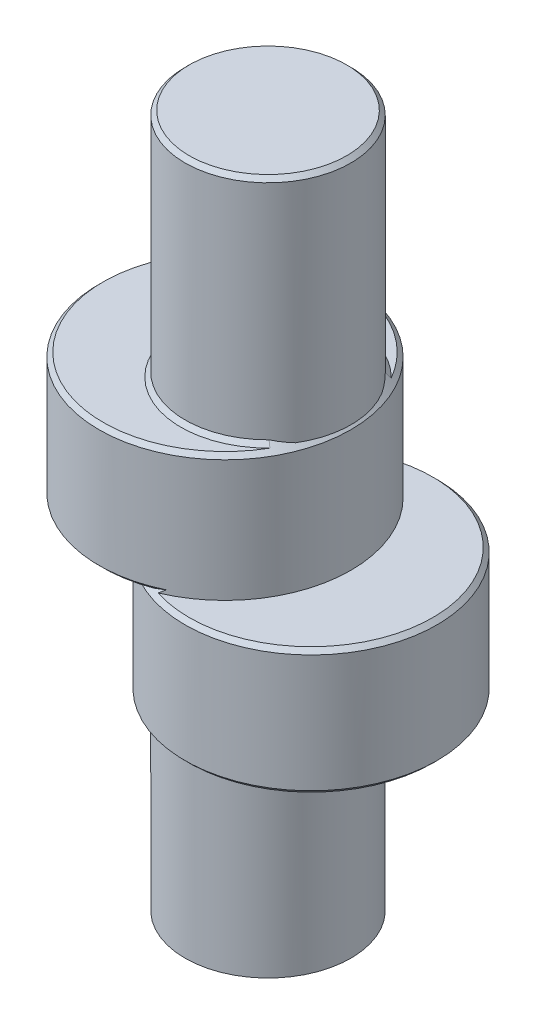
ISO-10303-21;
HEADER;
FILE_DESCRIPTION(('STEP AP214'),'2;1');
FILE_NAME('part.step','',(''),(''),'','','');
FILE_SCHEMA(('AUTOMOTIVE_DESIGN { 1 0 10303 214 1 1 1 1 }'));
ENDSEC;
DATA;
#1=APPLICATION_CONTEXT('core data for automotive mechanical design processes');
#2=APPLICATION_PROTOCOL_DEFINITION('international standard','automotive_design',2000,#1);
#3=PRODUCT_CONTEXT('',#1,'mechanical');
#4=PRODUCT('Part','Part','',(#3));
#5=PRODUCT_RELATED_PRODUCT_CATEGORY('part','',(#4));
#6=PRODUCT_DEFINITION_FORMATION('','',#4);
#7=PRODUCT_DEFINITION_CONTEXT('part definition',#1,'design');
#8=PRODUCT_DEFINITION('design','',#6,#7);
#9=PRODUCT_DEFINITION_SHAPE('','',#8);
#10=(LENGTH_UNIT() NAMED_UNIT(*) SI_UNIT(.MILLI.,.METRE.));
#11=(NAMED_UNIT(*) PLANE_ANGLE_UNIT() SI_UNIT($,.RADIAN.));
#12=(NAMED_UNIT(*) SI_UNIT($,.STERADIAN.) SOLID_ANGLE_UNIT());
#13=UNCERTAINTY_MEASURE_WITH_UNIT(LENGTH_MEASURE(1.E-05),#10,'distance_accuracy_value','');
#14=(GEOMETRIC_REPRESENTATION_CONTEXT(3) GLOBAL_UNCERTAINTY_ASSIGNED_CONTEXT((#13)) GLOBAL_UNIT_ASSIGNED_CONTEXT((#10,
#11,#12)) REPRESENTATION_CONTEXT('',''));
#15=CARTESIAN_POINT('',(0.,0.,0.));
#16=DIRECTION('',(0.,0.,1.));
#17=DIRECTION('',(1.,0.,0.));
#18=AXIS2_PLACEMENT_3D('',#15,#16,#17);
#19=CARTESIAN_POINT('',(0.,10.,0.));
#20=DIRECTION('',(0.,-1.,0.));
#21=DIRECTION('',(0.,0.,-1.));
#22=AXIS2_PLACEMENT_3D('',#19,#20,#21);
#23=CYLINDRICAL_SURFACE('',#22,3.95);
#24=CARTESIAN_POINT('',(0.,10.,0.));
#25=DIRECTION('',(0.,1.,0.));
#26=DIRECTION('',(0.,0.,1.));
#27=AXIS2_PLACEMENT_3D('',#24,#25,#26);
#28=CIRCLE('',#27,3.95);
#29=CARTESIAN_POINT('',(-3.37439024390243,10.,2.05328772505368));
#30=VERTEX_POINT('',#29);
#31=CARTESIAN_POINT('',(-3.37439024390243,10.,-2.05328772505368));
#32=VERTEX_POINT('',#31);
#33=EDGE_CURVE('E157',#30,#32,#28,.T.);
#34=ORIENTED_EDGE('',*,*,#33,.F.);
#35=CARTESIAN_POINT('',(-3.37439024390243,10.,2.05328772505369));
#36=CARTESIAN_POINT('',(-3.42967364303386,10.0195381703899,1.96246057851847));
#37=CARTESIAN_POINT('',(-3.48139858508568,10.0377231002952,1.86917038134896));
#38=CARTESIAN_POINT('',(-3.57732520450853,10.0713133705831,1.67828200673555));
#39=CARTESIAN_POINT('',(-3.62152446386587,10.0867178176873,1.58068245732677));
#40=CARTESIAN_POINT('',(-3.70100269343805,10.1143297136207,1.38421253707191));
#41=CARTESIAN_POINT('',(-3.73646851013048,10.1266043734462,1.28542733187354));
#42=CARTESIAN_POINT('',(-3.79948032301669,10.1483600657345,1.08511589292342));
#43=CARTESIAN_POINT('',(-3.82702897939272,10.1578420365733,0.983590592421377));
#44=CARTESIAN_POINT('',(-3.88317962393429,10.1771369006507,0.738143815824763));
#45=CARTESIAN_POINT('',(-3.90795747359519,10.1856211614256,0.593210719135296));
#46=CARTESIAN_POINT('',(-3.93305010961774,10.1942065758194,0.373109785587389));
#47=CARTESIAN_POINT('',(-3.93940282862085,10.1963784557658,0.298649728434228));
#48=CARTESIAN_POINT('',(-3.94787753357165,10.1992748807604,0.14946687337808));
#49=CARTESIAN_POINT('',(-3.94999984103968,10.1999995358009,0.0747440958748538));
#50=CARTESIAN_POINT('',(-3.95,10.2,9.71357262047595E-12));
#51=B_SPLINE_CURVE_WITH_KNOTS('',3,(#35,#36,#37,#38,#39,#40,#41,#42,#43,#44,#45,#46,#47,#48,#49,
#50),.UNSPECIFIED.,.F.,.F.,(4,2,2,2,2,2,2,4),(0.,0.324240447661163,0.648584878499235,
0.965229897077277,1.28176839754942,1.72244864375406,1.94662192283391,2.17077816361467),.UNSPECIFIED.);
#52=CARTESIAN_POINT('',(-3.95,10.2,9.71379337256074E-12));
#53=VERTEX_POINT('',#52);
#54=EDGE_CURVE('E12',#30,#53,#51,.T.);
#55=ORIENTED_EDGE('',*,*,#54,.T.);
#56=CARTESIAN_POINT('',(-3.95,10.2,9.71379337256074E-12));
#57=CARTESIAN_POINT('',(-3.95001468505227,10.200002642253,-0.107369212286794));
#58=CARTESIAN_POINT('',(-3.9456226945118,10.198504344766,-0.214733994457491));
#59=CARTESIAN_POINT('',(-3.92813265017341,10.1925253786307,-0.428676269684234));
#60=CARTESIAN_POINT('',(-3.91503401450889,10.1880445106568,-0.535253709640706));
#61=CARTESIAN_POINT('',(-3.88064553944285,10.176259582332,-0.744350263658397));
#62=CARTESIAN_POINT('',(-3.859554764775,10.1690241134194,-0.846905961893443));
#63=CARTESIAN_POINT('',(-3.80938651502774,10.1517694211677,-1.04975943933612));
#64=CARTESIAN_POINT('',(-3.78031108769569,10.1417509115608,-1.15005779033799));
#65=CARTESIAN_POINT('',(-3.70069847976816,10.1142307854436,-1.38890936473224));
#66=CARTESIAN_POINT('',(-3.64626379002597,10.0953496172278,-1.52603761151626));
#67=CARTESIAN_POINT('',(-3.55320729017361,10.0628720527805,-1.72708239966373));
#68=CARTESIAN_POINT('',(-3.51995374926938,10.0512359727395,-1.79387181355818));
#69=CARTESIAN_POINT('',(-3.44984165088276,10.0266200925371,-1.92526142978619));
#70=CARTESIAN_POINT('',(-3.41298368278576,10.0136405120408,-1.98986198771668));
#71=CARTESIAN_POINT('',(-3.37439024391223,10.0000000000035,-2.05328772503757));
#72=B_SPLINE_CURVE_WITH_KNOTS('',3,(#56,#57,#58,#59,#60,#61,#62,#63,#64,#65,#66,#67,#68,#69,#70,
#71),.UNSPECIFIED.,.F.,.F.,(4,2,2,2,2,2,2,4),(0.,0.322000303432794,0.64402212836478,
0.958500659210683,1.27289861395836,1.71795919754196,1.94438601703123,2.17077587358222),.UNSPECIFIED.);
#73=EDGE_CURVE('E63',#53,#32,#72,.T.);
#74=ORIENTED_EDGE('',*,*,#73,.T.);
#75=EDGE_LOOP('',(#34,#55,#74));
#76=FACE_BOUND('',#75,.T.);
#77=CARTESIAN_POINT('',(0.,0.,0.));
#78=DIRECTION('',(0.,1.,0.));
#79=DIRECTION('',(0.,0.,1.));
#80=AXIS2_PLACEMENT_3D('',#77,#78,#79);
#81=CIRCLE('',#80,3.95);
#82=CARTESIAN_POINT('',(0.,0.,3.95));
#83=VERTEX_POINT('',#82);
#84=EDGE_CURVE('E152',#83,#83,#81,.T.);
#85=ORIENTED_EDGE('',*,*,#84,.T.);
#86=EDGE_LOOP('',(#85));
#87=FACE_BOUND('',#86,.T.);
#88=ADVANCED_FACE('F49',(#76,#87),#23,.T.);
#89=CARTESIAN_POINT('',(0.,0.,0.));
#90=DIRECTION('',(0.,1.,0.));
#91=DIRECTION('',(0.,0.,1.));
#92=AXIS2_PLACEMENT_3D('',#89,#90,#91);
#93=PLANE('',#92);
#94=DIRECTION('',(1.,0.,0.));
#95=VECTOR('',#94,1.);
#96=CARTESIAN_POINT('',(1.36381816969858,0.,-2.95));
#97=LINE('',#96,#95);
#98=CARTESIAN_POINT('',(-1.36381816969858,0.,-2.95));
#99=VERTEX_POINT('',#98);
#100=CARTESIAN_POINT('',(1.36381816969858,0.,-2.95));
#101=VERTEX_POINT('',#100);
#102=EDGE_CURVE('E144',#99,#101,#97,.T.);
#103=ORIENTED_EDGE('',*,*,#102,.F.);
#104=CARTESIAN_POINT('',(0.,0.,0.));
#105=DIRECTION('',(0.,-1.,0.));
#106=DIRECTION('',(0.,0.,-1.));
#107=AXIS2_PLACEMENT_3D('',#104,#105,#106);
#108=CIRCLE('',#107,3.25);
#109=EDGE_CURVE('E72',#101,#99,#108,.T.);
#110=ORIENTED_EDGE('',*,*,#109,.F.);
#111=EDGE_LOOP('',(#103,#110));
#112=FACE_BOUND('',#111,.T.);
#113=ORIENTED_EDGE('',*,*,#84,.F.);
#114=EDGE_LOOP('',(#113));
#115=FACE_BOUND('',#114,.T.);
#116=ADVANCED_FACE('F273',(#112,#115),#93,.F.);
#117=CARTESIAN_POINT('',(2.05,16.,0.));
#118=DIRECTION('',(0.,-1.,0.));
#119=DIRECTION('',(0.,0.,-1.));
#120=AXIS2_PLACEMENT_3D('',#117,#118,#119);
#121=CYLINDRICAL_SURFACE('',#120,6.);
#122=CARTESIAN_POINT('',(2.05,10.2,0.));
#123=DIRECTION('',(0.,1.,0.));
#124=DIRECTION('',(0.,0.,1.));
#125=AXIS2_PLACEMENT_3D('',#122,#123,#124);
#126=CIRCLE('',#125,6.);
#127=EDGE_CURVE('E263',#53,#53,#126,.T.);
#128=ORIENTED_EDGE('',*,*,#127,.T.);
#129=EDGE_LOOP('',(#128));
#130=FACE_BOUND('',#129,.T.);
#131=CARTESIAN_POINT('',(2.05,15.8,0.));
#132=DIRECTION('',(0.,1.,0.));
#133=DIRECTION('',(0.,0.,1.));
#134=AXIS2_PLACEMENT_3D('',#131,#132,#133);
#135=CIRCLE('',#134,6.);
#136=CARTESIAN_POINT('',(2.05,15.8,6.));
#137=VERTEX_POINT('',#136);
#138=EDGE_CURVE('E163',#137,#137,#135,.F.);
#139=ORIENTED_EDGE('',*,*,#138,.T.);
#140=EDGE_LOOP('',(#139));
#141=FACE_BOUND('',#140,.T.);
#142=ADVANCED_FACE('F280',(#130,#141),#121,.T.);
#143=CARTESIAN_POINT('',(2.05,16.,0.));
#144=DIRECTION('',(0.,1.,0.));
#145=DIRECTION('',(0.,0.,1.));
#146=AXIS2_PLACEMENT_3D('',#143,#144,#145);
#147=PLANE('',#146);
#148=CARTESIAN_POINT('',(-2.05,16.,0.));
#149=DIRECTION('',(0.,1.,0.));
#150=DIRECTION('',(0.,0.,1.));
#151=AXIS2_PLACEMENT_3D('',#148,#149,#150);
#152=CIRCLE('',#151,6.);
#153=CARTESIAN_POINT('',(0.287804878048774,16.,5.52581834230654));
#154=VERTEX_POINT('',#153);
#155=CARTESIAN_POINT('',(0.287804878048774,16.,-5.52581834230654));
#156=VERTEX_POINT('',#155);
#157=EDGE_CURVE('E155',#154,#156,#152,.T.);
#158=ORIENTED_EDGE('',*,*,#157,.F.);
#159=CARTESIAN_POINT('',(2.05,16.,0.));
#160=DIRECTION('',(0.,1.,0.));
#161=DIRECTION('',(0.,0.,1.));
#162=AXIS2_PLACEMENT_3D('',#159,#160,#161);
#163=CIRCLE('',#162,5.80000000000001);
#164=EDGE_CURVE('E159',#154,#156,#163,.T.);
#165=ORIENTED_EDGE('',*,*,#164,.T.);
#166=EDGE_LOOP('',(#158,#165));
#167=FACE_BOUND('',#166,.T.);
#168=ADVANCED_FACE('F196',(#167),#147,.T.);
#169=CARTESIAN_POINT('',(2.05,10.,0.));
#170=DIRECTION('',(0.,1.,0.));
#171=DIRECTION('',(0.,0.,1.));
#172=AXIS2_PLACEMENT_3D('',#169,#170,#171);
#173=PLANE('',#172);
#174=ORIENTED_EDGE('',*,*,#33,.T.);
#175=CARTESIAN_POINT('',(2.05,10.,0.));
#176=DIRECTION('',(0.,1.,0.));
#177=DIRECTION('',(0.,0.,1.));
#178=AXIS2_PLACEMENT_3D('',#175,#176,#177);
#179=CIRCLE('',#178,5.8);
#180=EDGE_CURVE('E264',#32,#30,#179,.F.);
#181=ORIENTED_EDGE('',*,*,#180,.T.);
#182=EDGE_LOOP('',(#174,#181));
#183=FACE_BOUND('',#182,.T.);
#184=ADVANCED_FACE('F282',(#183),#173,.F.);
#185=CARTESIAN_POINT('',(2.05,16.,0.));
#186=DIRECTION('',(0.,-1.,0.));
#187=DIRECTION('',(0.,0.,-1.));
#188=AXIS2_PLACEMENT_3D('',#185,#186,#187);
#189=CONICAL_SURFACE('',#188,5.80000000000001,0.78539816339744);
#190=ORIENTED_EDGE('',*,*,#138,.F.);
#191=EDGE_LOOP('',(#190));
#192=FACE_BOUND('',#191,.T.);
#193=CARTESIAN_POINT('',(0.,16.,-5.42563360355268));
#194=VERTEX_POINT('',#193);
#195=CARTESIAN_POINT('',(0.,16.,5.42563360355268));
#196=VERTEX_POINT('',#195);
#197=EDGE_CURVE('E165',#194,#196,#163,.T.);
#198=ORIENTED_EDGE('',*,*,#197,.F.);
#199=CARTESIAN_POINT('',(0.,16.,-5.42563360355268));
#200=CARTESIAN_POINT('',(0.0944842992991663,16.0333953126833,-5.42563331300111));
#201=CARTESIAN_POINT('',(0.188880902383319,16.0667596292907,-5.42347627630404));
#202=CARTESIAN_POINT('',(0.377498788697151,16.133426296005,-5.41484870729925));
#203=CARTESIAN_POINT('',(0.471720071791857,16.1667286460644,-5.40837817167207));
#204=CARTESIAN_POINT('',(0.565853658536573,16.2,-5.39975088657994));
#205=B_SPLINE_CURVE_WITH_KNOTS('',3,(#199,#200,#201,#202,#203,#204),.UNSPECIFIED.,.F.,.F.,(4,2,
4),(0.,0.300427931348473,0.600856093891717),.UNSPECIFIED.);
#206=CARTESIAN_POINT('',(0.565853658536573,16.2,-5.39975088657994));
#207=VERTEX_POINT('',#206);
#208=EDGE_CURVE('E216',#194,#207,#205,.T.);
#209=ORIENTED_EDGE('',*,*,#208,.T.);
#210=CARTESIAN_POINT('',(0.287804878048774,16.,-5.52581834230654));
#211=CARTESIAN_POINT('',(0.334764574924519,16.0331932347626,-5.50594836551034));
#212=CARTESIAN_POINT('',(0.381415158021299,16.0664565209714,-5.48550775437168));
#213=CARTESIAN_POINT('',(0.474098084690947,16.1331231876742,-5.44348526883482));
#214=CARTESIAN_POINT('',(0.52013042842345,16.1665265681321,-5.42190339473131));
#215=CARTESIAN_POINT('',(0.565853658536623,16.2,-5.39975088658003));
#216=B_SPLINE_CURVE_WITH_KNOTS('',3,(#210,#211,#212,#213,#214,#215),.UNSPECIFIED.,.F.,.F.,(4,2,
4),(0.,0.18249623357096,0.36499242001898),.UNSPECIFIED.);
#217=EDGE_CURVE('E172',#156,#207,#216,.T.);
#218=ORIENTED_EDGE('',*,*,#217,.F.);
#219=ORIENTED_EDGE('',*,*,#164,.F.);
#220=CARTESIAN_POINT('',(0.565853658536573,16.2,5.39975088657994));
#221=CARTESIAN_POINT('',(0.520130428423416,16.1665265681321,5.42190339473125));
#222=CARTESIAN_POINT('',(0.474098084690929,16.1331231876742,5.44348526883479));
#223=CARTESIAN_POINT('',(0.381415158021321,16.0664565209714,5.48550775437171));
#224=CARTESIAN_POINT('',(0.334764574924563,16.0331932347626,5.50594836551041));
#225=CARTESIAN_POINT('',(0.287804878048843,16.,5.52581834230665));
#226=B_SPLINE_CURVE_WITH_KNOTS('',3,(#220,#221,#222,#223,#224,#225),.UNSPECIFIED.,.F.,.F.,(4,2,
4),(0.,0.182496186448023,0.364992420018979),.UNSPECIFIED.);
#227=CARTESIAN_POINT('',(0.565853658536573,16.2,5.39975088657994));
#228=VERTEX_POINT('',#227);
#229=EDGE_CURVE('E197',#228,#154,#226,.T.);
#230=ORIENTED_EDGE('',*,*,#229,.F.);
#231=CARTESIAN_POINT('',(0.565853658536573,16.2,5.39975088657994));
#232=CARTESIAN_POINT('',(0.471720071791857,16.1667286460644,5.40837817167207));
#233=CARTESIAN_POINT('',(0.377498788697151,16.133426296005,5.41484870729925));
#234=CARTESIAN_POINT('',(0.188880902383319,16.0667596292907,5.42347627630404));
#235=CARTESIAN_POINT('',(0.0944842992991671,16.0333953126833,5.42563331300111));
#236=CARTESIAN_POINT('',(0.,16.,5.42563360355268));
#237=B_SPLINE_CURVE_WITH_KNOTS('',3,(#231,#232,#233,#234,#235,#236),.UNSPECIFIED.,.F.,.F.,(4,2,
4),(0.,0.300428162543244,0.600856093891716),.UNSPECIFIED.);
#238=EDGE_CURVE('E208',#228,#196,#237,.T.);
#239=ORIENTED_EDGE('',*,*,#238,.T.);
#240=EDGE_LOOP('',(#198,#209,#218,#219,#230,#239));
#241=FACE_BOUND('',#240,.T.);
#242=ADVANCED_FACE('F185',(#192,#241),#189,.T.);
#243=CARTESIAN_POINT('',(-2.05,16.,0.));
#244=DIRECTION('',(0.,1.,0.));
#245=DIRECTION('',(0.,0.,1.));
#246=AXIS2_PLACEMENT_3D('',#243,#244,#245);
#247=PLANE('',#246);
#248=ORIENTED_EDGE('',*,*,#197,.T.);
#249=CARTESIAN_POINT('',(-2.05,16.,0.));
#250=DIRECTION('',(0.,1.,0.));
#251=DIRECTION('',(0.,0.,1.));
#252=AXIS2_PLACEMENT_3D('',#249,#250,#251);
#253=CIRCLE('',#252,5.8);
#254=EDGE_CURVE('E209',#196,#194,#253,.F.);
#255=ORIENTED_EDGE('',*,*,#254,.T.);
#256=EDGE_LOOP('',(#248,#255));
#257=FACE_BOUND('',#256,.T.);
#258=ADVANCED_FACE('F193',(#257),#247,.F.);
#259=CARTESIAN_POINT('',(-2.05,22.,0.));
#260=DIRECTION('',(0.,-1.,0.));
#261=DIRECTION('',(0.,0.,-1.));
#262=AXIS2_PLACEMENT_3D('',#259,#260,#261);
#263=CYLINDRICAL_SURFACE('',#262,6.);
#264=CARTESIAN_POINT('',(-2.05,21.8,0.));
#265=DIRECTION('',(0.,1.,0.));
#266=DIRECTION('',(0.,0.,1.));
#267=AXIS2_PLACEMENT_3D('',#264,#265,#266);
#268=CIRCLE('',#267,6.);
#269=CARTESIAN_POINT('',(-2.05,21.8,6.));
#270=VERTEX_POINT('',#269);
#271=EDGE_CURVE('E204',#270,#270,#268,.F.);
#272=ORIENTED_EDGE('',*,*,#271,.T.);
#273=EDGE_LOOP('',(#272));
#274=FACE_BOUND('',#273,.T.);
#275=CARTESIAN_POINT('',(-2.05,16.2,0.));
#276=DIRECTION('',(0.,1.,0.));
#277=DIRECTION('',(0.,0.,1.));
#278=AXIS2_PLACEMENT_3D('',#275,#276,#277);
#279=CIRCLE('',#278,6.);
#280=EDGE_CURVE('E183',#207,#228,#279,.T.);
#281=ORIENTED_EDGE('',*,*,#280,.T.);
#282=ORIENTED_EDGE('',*,*,#229,.T.);
#283=ORIENTED_EDGE('',*,*,#157,.T.);
#284=ORIENTED_EDGE('',*,*,#217,.T.);
#285=EDGE_LOOP('',(#281,#282,#283,#284));
#286=FACE_BOUND('',#285,.T.);
#287=ADVANCED_FACE('F190',(#274,#286),#263,.T.);
#288=CARTESIAN_POINT('',(-2.05,22.,0.));
#289=DIRECTION('',(0.,1.,0.));
#290=DIRECTION('',(0.,0.,1.));
#291=AXIS2_PLACEMENT_3D('',#288,#289,#290);
#292=PLANE('',#291);
#293=CARTESIAN_POINT('',(-2.05,22.,0.));
#294=DIRECTION('',(0.,1.,0.));
#295=DIRECTION('',(0.,0.,1.));
#296=AXIS2_PLACEMENT_3D('',#293,#294,#295);
#297=CIRCLE('',#296,5.8);
#298=CARTESIAN_POINT('',(2.97926829268294,22.,-2.88902413285422));
#299=VERTEX_POINT('',#298);
#300=CARTESIAN_POINT('',(2.97926829268294,22.,2.88902413285422));
#301=VERTEX_POINT('',#300);
#302=EDGE_CURVE('E170',#299,#301,#297,.T.);
#303=ORIENTED_EDGE('',*,*,#302,.T.);
#304=CARTESIAN_POINT('',(0.,22.,0.));
#305=DIRECTION('',(0.,1.,0.));
#306=DIRECTION('',(0.,0.,1.));
#307=AXIS2_PLACEMENT_3D('',#304,#305,#306);
#308=CIRCLE('',#307,4.14999999999999);
#309=EDGE_CURVE('E333',#301,#299,#308,.F.);
#310=ORIENTED_EDGE('',*,*,#309,.T.);
#311=EDGE_LOOP('',(#303,#310));
#312=FACE_BOUND('',#311,.T.);
#313=ADVANCED_FACE('F195',(#312),#292,.T.);
#314=CARTESIAN_POINT('',(-2.05,22.,0.));
#315=DIRECTION('',(0.,-1.,0.));
#316=DIRECTION('',(0.,0.,-1.));
#317=AXIS2_PLACEMENT_3D('',#314,#315,#316);
#318=CONICAL_SURFACE('',#317,5.8,0.78539816339744);
#319=ORIENTED_EDGE('',*,*,#271,.F.);
#320=EDGE_LOOP('',(#319));
#321=FACE_BOUND('',#320,.T.);
#322=CARTESIAN_POINT('',(3.37439024390244,22.,2.05328772505367));
#323=VERTEX_POINT('',#322);
#324=CARTESIAN_POINT('',(3.37439024390244,22.,-2.05328772505367));
#325=VERTEX_POINT('',#324);
#326=EDGE_CURVE('E168',#323,#325,#297,.T.);
#327=ORIENTED_EDGE('',*,*,#326,.F.);
#328=CARTESIAN_POINT('',(2.81829268292683,22.2,2.76762106390327));
#329=CARTESIAN_POINT('',(2.87093843934031,22.1807280631961,2.71401551945338));
#330=CARTESIAN_POINT('',(2.92216352995046,22.1620753376047,2.6587888386555));
#331=CARTESIAN_POINT('',(3.02139219781377,22.1261097342583,2.54545418180636));
#332=CARTESIAN_POINT('',(3.06940622904822,22.1087924773808,2.48735674611407));
#333=CARTESIAN_POINT('',(3.16219858432483,22.0754657828254,2.36826900654989));
#334=CARTESIAN_POINT('',(3.20697678607583,22.0594563945724,2.30727859348834));
#335=CARTESIAN_POINT('',(3.29324985058238,22.0287297424041,2.18238217126109));
#336=CARTESIAN_POINT('',(3.33473287331811,22.0140171188761,2.11846684344766));
#337=CARTESIAN_POINT('',(3.37439024390244,22.,2.05328772505367));
#338=B_SPLINE_CURVE_WITH_KNOTS('',3,(#328,#329,#330,#331,#332,#333,#334,#335,#336,#337),
.UNSPECIFIED.,.F.,.F.,(4,2,2,2,4),(0.,0.232670046481311,0.464541479491737,0.696421671001622,
0.929100527613504),.UNSPECIFIED.);
#339=CARTESIAN_POINT('',(2.81829268292683,22.2,2.76762106390327));
#340=VERTEX_POINT('',#339);
#341=EDGE_CURVE('E325',#340,#323,#338,.T.);
#342=ORIENTED_EDGE('',*,*,#341,.F.);
#343=CARTESIAN_POINT('',(2.81829268292683,22.2,2.76762106390327));
#344=CARTESIAN_POINT('',(2.84511729739989,22.1666724487051,2.78787060500535));
#345=CARTESIAN_POINT('',(2.87194423879979,22.1333420063698,2.80811229798179));
#346=CARTESIAN_POINT('',(2.92560277538518,22.0666753397031,2.84857998763207));
#347=CARTESIAN_POINT('',(2.95243437057064,22.0333391153717,2.86880598430594));
#348=CARTESIAN_POINT('',(2.97926829268294,22.,2.88902413285422));
#349=B_SPLINE_CURVE_WITH_KNOTS('',3,(#343,#344,#345,#346,#347,#348),.UNSPECIFIED.,.F.,.F.,(4,2,
4),(0.,0.141996351189845,0.283992702019304),.UNSPECIFIED.);
#350=EDGE_CURVE('E249',#340,#301,#349,.T.);
#351=ORIENTED_EDGE('',*,*,#350,.T.);
#352=ORIENTED_EDGE('',*,*,#302,.F.);
#353=CARTESIAN_POINT('',(2.97926829268294,22.,-2.88902413285422));
#354=CARTESIAN_POINT('',(2.95243437057064,22.0333391153717,-2.86880598430594));
#355=CARTESIAN_POINT('',(2.92560277538518,22.0666753397031,-2.84857998763207));
#356=CARTESIAN_POINT('',(2.8719442387998,22.1333420063698,-2.80811229798179));
#357=CARTESIAN_POINT('',(2.8451172973999,22.1666724487051,-2.78787060500534));
#358=CARTESIAN_POINT('',(2.81829268292684,22.2,-2.76762106390327));
#359=B_SPLINE_CURVE_WITH_KNOTS('',3,(#353,#354,#355,#356,#357,#358),.UNSPECIFIED.,.F.,.F.,(4,2,
4),(0.,0.141996350829458,0.283992702019303),.UNSPECIFIED.);
#360=CARTESIAN_POINT('',(2.81829268292683,22.2,-2.76762106390327));
#361=VERTEX_POINT('',#360);
#362=EDGE_CURVE('E252',#299,#361,#359,.T.);
#363=ORIENTED_EDGE('',*,*,#362,.T.);
#364=CARTESIAN_POINT('',(3.37439024390244,22.,-2.05328772505367));
#365=CARTESIAN_POINT('',(3.33473287331811,22.0140171188761,-2.11846684344766));
#366=CARTESIAN_POINT('',(3.29324985058238,22.0287297424041,-2.18238217126109));
#367=CARTESIAN_POINT('',(3.20697678607582,22.0594563945724,-2.30727859348834));
#368=CARTESIAN_POINT('',(3.16219858432483,22.0754657828254,-2.36826900654989));
#369=CARTESIAN_POINT('',(3.06940622904822,22.1087924773808,-2.48735674611407));
#370=CARTESIAN_POINT('',(3.02139219781377,22.1261097342583,-2.54545418180636));
#371=CARTESIAN_POINT('',(2.92216352995046,22.1620753376047,-2.6587888386555));
#372=CARTESIAN_POINT('',(2.87093843934031,22.1807280631961,-2.71401551945338));
#373=CARTESIAN_POINT('',(2.81829268292683,22.2,-2.76762106390327));
#374=B_SPLINE_CURVE_WITH_KNOTS('',3,(#364,#365,#366,#367,#368,#369,#370,#371,#372,#373),
.UNSPECIFIED.,.F.,.F.,(4,2,2,2,4),(0.,0.232678856611885,0.464559048121768,0.696430481132193,
0.929100527613505),.UNSPECIFIED.);
#375=EDGE_CURVE('E307',#325,#361,#374,.T.);
#376=ORIENTED_EDGE('',*,*,#375,.F.);
#377=EDGE_LOOP('',(#327,#342,#351,#352,#363,#376));
#378=FACE_BOUND('',#377,.T.);
#379=ADVANCED_FACE('F231',(#321,#378),#318,.T.);
#380=CARTESIAN_POINT('',(-2.05,16.2,0.));
#381=DIRECTION('',(0.,1.,0.));
#382=DIRECTION('',(0.,0.,1.));
#383=AXIS2_PLACEMENT_3D('',#380,#381,#382);
#384=CONICAL_SURFACE('',#383,6.,0.785398163397446);
#385=ORIENTED_EDGE('',*,*,#208,.F.);
#386=ORIENTED_EDGE('',*,*,#254,.F.);
#387=ORIENTED_EDGE('',*,*,#238,.F.);
#388=ORIENTED_EDGE('',*,*,#280,.F.);
#389=EDGE_LOOP('',(#385,#386,#387,#388));
#390=FACE_BOUND('',#389,.T.);
#391=ADVANCED_FACE('F223',(#390),#384,.T.);
#392=CARTESIAN_POINT('',(0.,22.,0.));
#393=DIRECTION('',(0.,1.,0.));
#394=DIRECTION('',(0.,0.,1.));
#395=AXIS2_PLACEMENT_3D('',#392,#393,#394);
#396=PLANE('',#395);
#397=CARTESIAN_POINT('',(0.,22.,0.));
#398=DIRECTION('',(0.,1.,0.));
#399=DIRECTION('',(0.,0.,1.));
#400=AXIS2_PLACEMENT_3D('',#397,#398,#399);
#401=CIRCLE('',#400,3.95);
#402=EDGE_CURVE('E149',#323,#325,#401,.T.);
#403=ORIENTED_EDGE('',*,*,#402,.F.);
#404=ORIENTED_EDGE('',*,*,#326,.T.);
#405=EDGE_LOOP('',(#403,#404));
#406=FACE_BOUND('',#405,.T.);
#407=ADVANCED_FACE('F235',(#406),#396,.F.);
#408=CARTESIAN_POINT('',(0.,33.,0.));
#409=DIRECTION('',(0.,-1.,0.));
#410=DIRECTION('',(0.,0.,-1.));
#411=AXIS2_PLACEMENT_3D('',#408,#409,#410);
#412=CYLINDRICAL_SURFACE('',#411,3.95);
#413=CARTESIAN_POINT('',(0.,32.8,0.));
#414=DIRECTION('',(0.,1.,0.));
#415=DIRECTION('',(0.,0.,1.));
#416=AXIS2_PLACEMENT_3D('',#413,#414,#415);
#417=CIRCLE('',#416,3.95);
#418=CARTESIAN_POINT('',(0.,32.8,3.95));
#419=VERTEX_POINT('',#418);
#420=EDGE_CURVE('E304',#419,#419,#417,.F.);
#421=ORIENTED_EDGE('',*,*,#420,.T.);
#422=EDGE_LOOP('',(#421));
#423=FACE_BOUND('',#422,.T.);
#424=CARTESIAN_POINT('',(0.,22.2,0.));
#425=DIRECTION('',(0.,1.,0.));
#426=DIRECTION('',(0.,0.,1.));
#427=AXIS2_PLACEMENT_3D('',#424,#425,#426);
#428=CIRCLE('',#427,3.95);
#429=EDGE_CURVE('E308',#361,#340,#428,.T.);
#430=ORIENTED_EDGE('',*,*,#429,.T.);
#431=ORIENTED_EDGE('',*,*,#341,.T.);
#432=ORIENTED_EDGE('',*,*,#402,.T.);
#433=ORIENTED_EDGE('',*,*,#375,.T.);
#434=EDGE_LOOP('',(#430,#431,#432,#433));
#435=FACE_BOUND('',#434,.T.);
#436=ADVANCED_FACE('F318',(#423,#435),#412,.T.);
#437=CARTESIAN_POINT('',(0.,33.,0.));
#438=DIRECTION('',(0.,1.,0.));
#439=DIRECTION('',(0.,0.,1.));
#440=AXIS2_PLACEMENT_3D('',#437,#438,#439);
#441=PLANE('',#440);
#442=CARTESIAN_POINT('',(0.,33.,0.));
#443=DIRECTION('',(0.,1.,0.));
#444=DIRECTION('',(0.,0.,1.));
#445=AXIS2_PLACEMENT_3D('',#442,#443,#444);
#446=CIRCLE('',#445,3.75000000000001);
#447=CARTESIAN_POINT('',(0.,33.,3.75000000000001));
#448=VERTEX_POINT('',#447);
#449=EDGE_CURVE('E332',#448,#448,#446,.T.);
#450=ORIENTED_EDGE('',*,*,#449,.T.);
#451=EDGE_LOOP('',(#450));
#452=FACE_BOUND('',#451,.T.);
#453=ADVANCED_FACE('F243',(#452),#441,.T.);
#454=CARTESIAN_POINT('',(0.,22.2,0.));
#455=DIRECTION('',(0.,-1.,0.));
#456=DIRECTION('',(0.,0.,-1.));
#457=AXIS2_PLACEMENT_3D('',#454,#455,#456);
#458=CONICAL_SURFACE('',#457,3.95,0.785398163397435);
#459=ORIENTED_EDGE('',*,*,#362,.F.);
#460=ORIENTED_EDGE('',*,*,#309,.F.);
#461=ORIENTED_EDGE('',*,*,#350,.F.);
#462=ORIENTED_EDGE('',*,*,#429,.F.);
#463=EDGE_LOOP('',(#459,#460,#461,#462));
#464=FACE_BOUND('',#463,.T.);
#465=ADVANCED_FACE('F237',(#464),#458,.T.);
#466=CARTESIAN_POINT('',(0.,33.,0.));
#467=DIRECTION('',(0.,-1.,0.));
#468=DIRECTION('',(0.,0.,-1.));
#469=AXIS2_PLACEMENT_3D('',#466,#467,#468);
#470=CONICAL_SURFACE('',#469,3.75000000000001,0.785398163397435);
#471=ORIENTED_EDGE('',*,*,#420,.F.);
#472=EDGE_LOOP('',(#471));
#473=FACE_BOUND('',#472,.T.);
#474=ORIENTED_EDGE('',*,*,#449,.F.);
#475=EDGE_LOOP('',(#474));
#476=FACE_BOUND('',#475,.T.);
#477=ADVANCED_FACE('F245',(#473,#476),#470,.T.);
#478=CARTESIAN_POINT('',(2.05,10.2,0.));
#479=DIRECTION('',(0.,1.,0.));
#480=DIRECTION('',(0.,0.,1.));
#481=AXIS2_PLACEMENT_3D('',#478,#479,#480);
#482=CONICAL_SURFACE('',#481,6.,0.785398163397455);
#483=ORIENTED_EDGE('',*,*,#54,.F.);
#484=ORIENTED_EDGE('',*,*,#180,.F.);
#485=ORIENTED_EDGE('',*,*,#73,.F.);
#486=ORIENTED_EDGE('',*,*,#127,.F.);
#487=EDGE_LOOP('',(#483,#484,#485,#486));
#488=FACE_BOUND('',#487,.T.);
#489=ADVANCED_FACE('F52',(#488),#482,.T.);
#490=CARTESIAN_POINT('',(0.,14.,0.));
#491=DIRECTION('',(0.,-1.,0.));
#492=DIRECTION('',(0.,0.,-1.));
#493=AXIS2_PLACEMENT_3D('',#490,#491,#492);
#494=CYLINDRICAL_SURFACE('',#493,3.25);
#495=ORIENTED_EDGE('',*,*,#109,.T.);
#496=DIRECTION('',(0.,-1.,0.));
#497=VECTOR('',#496,1.);
#498=CARTESIAN_POINT('',(-1.36381816969858,14.,-2.95));
#499=LINE('',#498,#497);
#500=CARTESIAN_POINT('',(-1.36381816969858,14.,-2.95));
#501=VERTEX_POINT('',#500);
#502=EDGE_CURVE('E130',#501,#99,#499,.T.);
#503=ORIENTED_EDGE('',*,*,#502,.F.);
#504=CARTESIAN_POINT('',(0.,14.,0.));
#505=DIRECTION('',(0.,-1.,0.));
#506=DIRECTION('',(0.,0.,-1.));
#507=AXIS2_PLACEMENT_3D('',#504,#505,#506);
#508=CIRCLE('',#507,3.25);
#509=CARTESIAN_POINT('',(1.36381816969858,14.,-2.95));
#510=VERTEX_POINT('',#509);
#511=EDGE_CURVE('E129',#510,#501,#508,.T.);
#512=ORIENTED_EDGE('',*,*,#511,.F.);
#513=DIRECTION('',(0.,-1.,0.));
#514=VECTOR('',#513,1.);
#515=CARTESIAN_POINT('',(1.36381816969858,14.,-2.95));
#516=LINE('',#515,#514);
#517=EDGE_CURVE('E137',#510,#101,#516,.T.);
#518=ORIENTED_EDGE('',*,*,#517,.T.);
#519=EDGE_LOOP('',(#495,#503,#512,#518));
#520=FACE_BOUND('',#519,.T.);
#521=ADVANCED_FACE('F128',(#520),#494,.F.);
#522=CARTESIAN_POINT('',(1.36381816969858,14.,-2.95));
#523=DIRECTION('',(0.,0.,-1.));
#524=DIRECTION('',(-1.,0.,0.));
#525=AXIS2_PLACEMENT_3D('',#522,#523,#524);
#526=PLANE('',#525);
#527=ORIENTED_EDGE('',*,*,#102,.T.);
#528=ORIENTED_EDGE('',*,*,#517,.F.);
#529=DIRECTION('',(1.,0.,0.));
#530=VECTOR('',#529,1.);
#531=CARTESIAN_POINT('',(1.36381816969858,14.,-2.95));
#532=LINE('',#531,#530);
#533=EDGE_CURVE('E140',#501,#510,#532,.T.);
#534=ORIENTED_EDGE('',*,*,#533,.F.);
#535=ORIENTED_EDGE('',*,*,#502,.T.);
#536=EDGE_LOOP('',(#527,#528,#534,#535));
#537=FACE_BOUND('',#536,.T.);
#538=ADVANCED_FACE('F145',(#537),#526,.F.);
#539=CARTESIAN_POINT('',(0.,14.,0.));
#540=DIRECTION('',(0.,-1.,0.));
#541=DIRECTION('',(0.,0.,-1.));
#542=AXIS2_PLACEMENT_3D('',#539,#540,#541);
#543=PLANE('',#542);
#544=ORIENTED_EDGE('',*,*,#511,.T.);
#545=ORIENTED_EDGE('',*,*,#533,.T.);
#546=EDGE_LOOP('',(#544,#545));
#547=FACE_BOUND('',#546,.T.);
#548=ADVANCED_FACE('F138',(#547),#543,.T.);
#549=CLOSED_SHELL('',(#88,#116,#142,#168,#184,#242,#258,#287,#313,#379,#391,#407,#436,#453,#465,
#477,#489,#521,#538,#548));
#550=MANIFOLD_SOLID_BREP('B2',#549);
#551=ADVANCED_BREP_SHAPE_REPRESENTATION('',(#18,#550),#14);
#552=SHAPE_DEFINITION_REPRESENTATION(#9,#551);
ENDSEC;
END-ISO-10303-21;
